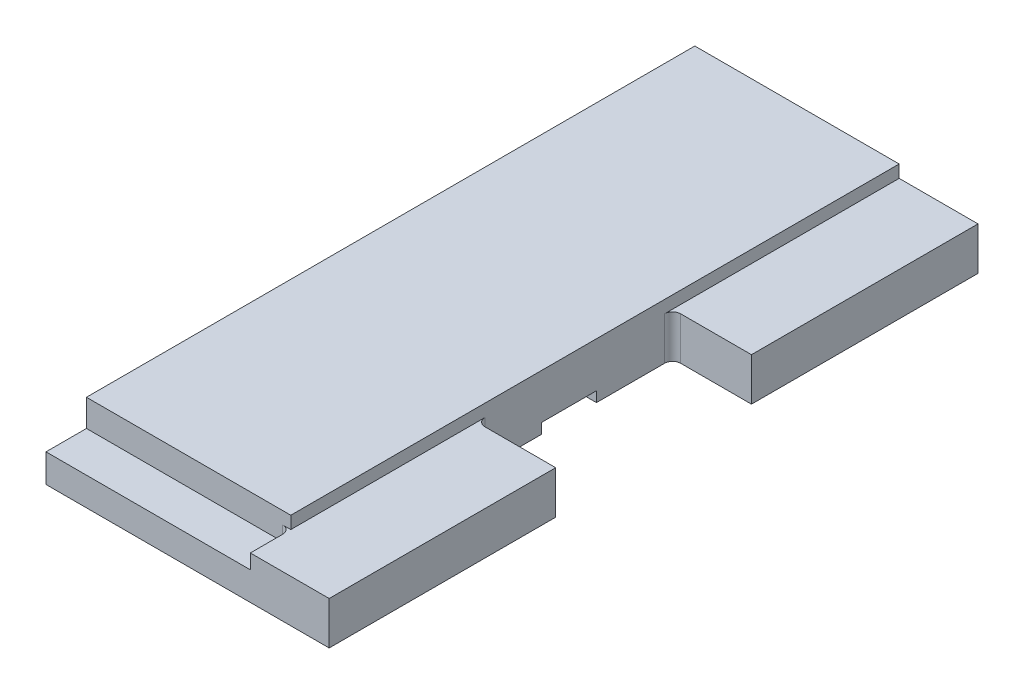
ISO-10303-21;
HEADER;
FILE_DESCRIPTION(('STEP AP214'),'2;1');
FILE_NAME('part.step','',(''),(''),'','','');
FILE_SCHEMA(('AUTOMOTIVE_DESIGN { 1 0 10303 214 1 1 1 1 }'));
ENDSEC;
DATA;
#1=APPLICATION_CONTEXT('core data for automotive mechanical design processes');
#2=APPLICATION_PROTOCOL_DEFINITION('international standard','automotive_design',2000,#1);
#3=PRODUCT_CONTEXT('',#1,'mechanical');
#4=PRODUCT('Part','Part','',(#3));
#5=PRODUCT_RELATED_PRODUCT_CATEGORY('part','',(#4));
#6=PRODUCT_DEFINITION_FORMATION('','',#4);
#7=PRODUCT_DEFINITION_CONTEXT('part definition',#1,'design');
#8=PRODUCT_DEFINITION('design','',#6,#7);
#9=PRODUCT_DEFINITION_SHAPE('','',#8);
#10=(LENGTH_UNIT() NAMED_UNIT(*) SI_UNIT(.MILLI.,.METRE.));
#11=(NAMED_UNIT(*) PLANE_ANGLE_UNIT() SI_UNIT($,.RADIAN.));
#12=(NAMED_UNIT(*) SI_UNIT($,.STERADIAN.) SOLID_ANGLE_UNIT());
#13=UNCERTAINTY_MEASURE_WITH_UNIT(LENGTH_MEASURE(1.E-05),#10,'distance_accuracy_value','');
#14=(GEOMETRIC_REPRESENTATION_CONTEXT(3) GLOBAL_UNCERTAINTY_ASSIGNED_CONTEXT((#13)) GLOBAL_UNIT_ASSIGNED_CONTEXT((#10,
#11,#12)) REPRESENTATION_CONTEXT('',''));
#15=CARTESIAN_POINT('',(0.,0.,0.));
#16=DIRECTION('',(0.,0.,1.));
#17=DIRECTION('',(1.,0.,0.));
#18=AXIS2_PLACEMENT_3D('',#15,#16,#17);
#19=CARTESIAN_POINT('',(13.1275,7.878312,-14.5));
#20=DIRECTION('',(0.,-1.,0.));
#21=DIRECTION('',(0.,0.,1.));
#22=AXIS2_PLACEMENT_3D('',#19,#20,#21);
#23=CYLINDRICAL_SURFACE('',#22,0.5);
#24=CARTESIAN_POINT('',(13.1275,0.,-14.5));
#25=DIRECTION('',(0.,1.,0.));
#26=DIRECTION('',(-1.,0.,0.));
#27=AXIS2_PLACEMENT_3D('',#24,#25,#26);
#28=CIRCLE('',#27,0.5);
#29=CARTESIAN_POINT('',(12.6275,0.,-14.5));
#30=VERTEX_POINT('',#29);
#31=CARTESIAN_POINT('',(13.1275,0.,-14.));
#32=VERTEX_POINT('',#31);
#33=EDGE_CURVE('E476',#30,#32,#28,.T.);
#34=ORIENTED_EDGE('',*,*,#33,.F.);
#35=DIRECTION('',(0.,-1.,0.));
#36=VECTOR('',#35,1.);
#37=CARTESIAN_POINT('',(12.6275,2.649996,-14.5));
#38=LINE('',#37,#36);
#39=CARTESIAN_POINT('',(12.6275,2.649996,-14.5));
#40=VERTEX_POINT('',#39);
#41=EDGE_CURVE('E408',#40,#30,#38,.T.);
#42=ORIENTED_EDGE('',*,*,#41,.F.);
#43=CARTESIAN_POINT('',(13.1275,2.649996,-14.5));
#44=DIRECTION('',(0.,-1.,0.));
#45=DIRECTION('',(0.,0.,1.));
#46=AXIS2_PLACEMENT_3D('',#43,#44,#45);
#47=CIRCLE('',#46,0.5);
#48=CARTESIAN_POINT('',(13.1275,2.649996,-14.));
#49=VERTEX_POINT('',#48);
#50=EDGE_CURVE('E381',#49,#40,#47,.T.);
#51=ORIENTED_EDGE('',*,*,#50,.F.);
#52=DIRECTION('',(0.,-1.,0.));
#53=VECTOR('',#52,1.);
#54=CARTESIAN_POINT('',(13.1275,2.649996,-14.));
#55=LINE('',#54,#53);
#56=EDGE_CURVE('E11',#49,#32,#55,.T.);
#57=ORIENTED_EDGE('',*,*,#56,.T.);
#58=EDGE_LOOP('',(#34,#42,#51,#57));
#59=FACE_BOUND('',#58,.T.);
#60=ADVANCED_FACE('F17',(#59),#23,.F.);
#61=CARTESIAN_POINT('',(12.6275,2.649996,-14.));
#62=DIRECTION('',(0.,0.,1.));
#63=DIRECTION('',(1.,0.,0.));
#64=AXIS2_PLACEMENT_3D('',#61,#62,#63);
#65=PLANE('',#64);
#66=DIRECTION('',(1.,0.,0.));
#67=VECTOR('',#66,1.);
#68=CARTESIAN_POINT('',(13.1275,2.649996,-14.));
#69=LINE('',#68,#67);
#70=CARTESIAN_POINT('',(17.5,2.649996,-14.));
#71=VERTEX_POINT('',#70);
#72=EDGE_CURVE('E605',#49,#71,#69,.T.);
#73=ORIENTED_EDGE('',*,*,#72,.T.);
#74=DIRECTION('',(0.,1.,0.));
#75=VECTOR('',#74,1.);
#76=CARTESIAN_POINT('',(17.5,0.,-14.));
#77=LINE('',#76,#75);
#78=CARTESIAN_POINT('',(17.5,0.,-14.));
#79=VERTEX_POINT('',#78);
#80=EDGE_CURVE('E309',#79,#71,#77,.T.);
#81=ORIENTED_EDGE('',*,*,#80,.F.);
#82=DIRECTION('',(-1.,0.,0.));
#83=VECTOR('',#82,1.);
#84=CARTESIAN_POINT('',(17.5,0.,-14.));
#85=LINE('',#84,#83);
#86=EDGE_CURVE('E486',#79,#32,#85,.T.);
#87=ORIENTED_EDGE('',*,*,#86,.T.);
#88=ORIENTED_EDGE('',*,*,#56,.F.);
#89=EDGE_LOOP('',(#73,#81,#87,#88));
#90=FACE_BOUND('',#89,.T.);
#91=ADVANCED_FACE('F19',(#90),#65,.F.);
#92=CARTESIAN_POINT('',(12.95,0.,-36.41599999935));
#93=DIRECTION('',(1.,0.,0.));
#94=DIRECTION('',(0.,1.,0.));
#95=AXIS2_PLACEMENT_3D('',#92,#93,#94);
#96=PLANE('',#95);
#97=DIRECTION('',(0.,0.,1.));
#98=VECTOR('',#97,1.);
#99=CARTESIAN_POINT('',(12.95,0.,-35.91599999935));
#100=LINE('',#99,#98);
#101=CARTESIAN_POINT('',(12.95,0.,-35.91599999935));
#102=VERTEX_POINT('',#101);
#103=CARTESIAN_POINT('',(12.95,0.,-33.51599999935));
#104=VERTEX_POINT('',#103);
#105=EDGE_CURVE('E391',#102,#104,#100,.T.);
#106=ORIENTED_EDGE('',*,*,#105,.T.);
#107=DIRECTION('',(0.,1.,0.));
#108=VECTOR('',#107,1.);
#109=CARTESIAN_POINT('',(12.95,0.,-33.51599999935));
#110=LINE('',#109,#108);
#111=CARTESIAN_POINT('',(12.95,0.6362,-33.51599999935));
#112=VERTEX_POINT('',#111);
#113=EDGE_CURVE('E27',#104,#112,#110,.T.);
#114=ORIENTED_EDGE('',*,*,#113,.T.);
#115=DIRECTION('',(0.,0.,1.));
#116=VECTOR('',#115,1.);
#117=CARTESIAN_POINT('',(12.95,0.6362,-35.91599999935));
#118=LINE('',#117,#116);
#119=CARTESIAN_POINT('',(12.95,0.6362,-35.91599999935));
#120=VERTEX_POINT('',#119);
#121=EDGE_CURVE('E530',#120,#112,#118,.T.);
#122=ORIENTED_EDGE('',*,*,#121,.F.);
#123=DIRECTION('',(0.,1.,0.));
#124=VECTOR('',#123,1.);
#125=CARTESIAN_POINT('',(12.95,0.,-35.91599999935));
#126=LINE('',#125,#124);
#127=EDGE_CURVE('E347',#102,#120,#126,.T.);
#128=ORIENTED_EDGE('',*,*,#127,.F.);
#129=EDGE_LOOP('',(#106,#114,#122,#128));
#130=FACE_BOUND('',#129,.T.);
#131=ADVANCED_FACE('F669',(#130),#96,.F.);
#132=CARTESIAN_POINT('',(12.45,-4.458312,-33.51599999935));
#133=DIRECTION('',(0.,1.,0.));
#134=DIRECTION('',(0.,0.,1.));
#135=AXIS2_PLACEMENT_3D('',#132,#133,#134);
#136=CYLINDRICAL_SURFACE('',#135,0.5);
#137=ORIENTED_EDGE('',*,*,#113,.F.);
#138=CARTESIAN_POINT('',(12.45,0.,-33.51599999935));
#139=DIRECTION('',(0.,1.,0.));
#140=DIRECTION('',(0.,0.,1.));
#141=AXIS2_PLACEMENT_3D('',#138,#139,#140);
#142=CIRCLE('',#141,0.5);
#143=CARTESIAN_POINT('',(12.45,0.,-33.01599999935));
#144=VERTEX_POINT('',#143);
#145=EDGE_CURVE('E377',#144,#104,#142,.T.);
#146=ORIENTED_EDGE('',*,*,#145,.F.);
#147=DIRECTION('',(0.,1.,0.));
#148=VECTOR('',#147,1.);
#149=CARTESIAN_POINT('',(12.45,0.,-33.01599999935));
#150=LINE('',#149,#148);
#151=CARTESIAN_POINT('',(12.45,0.6362,-33.01599999935));
#152=VERTEX_POINT('',#151);
#153=EDGE_CURVE('E21',#144,#152,#150,.T.);
#154=ORIENTED_EDGE('',*,*,#153,.T.);
#155=CARTESIAN_POINT('',(12.45,0.6362,-33.51599999935));
#156=DIRECTION('',(0.,-1.,0.));
#157=DIRECTION('',(1.,0.,0.));
#158=AXIS2_PLACEMENT_3D('',#155,#156,#157);
#159=CIRCLE('',#158,0.5);
#160=EDGE_CURVE('E482',#112,#152,#159,.T.);
#161=ORIENTED_EDGE('',*,*,#160,.F.);
#162=EDGE_LOOP('',(#137,#146,#154,#161));
#163=FACE_BOUND('',#162,.T.);
#164=ADVANCED_FACE('F661',(#163),#136,.F.);
#165=CARTESIAN_POINT('',(12.95,0.,-33.01599999935));
#166=DIRECTION('',(0.,0.,1.));
#167=DIRECTION('',(1.,0.,0.));
#168=AXIS2_PLACEMENT_3D('',#165,#166,#167);
#169=PLANE('',#168);
#170=DIRECTION('',(-1.,0.,0.));
#171=VECTOR('',#170,1.);
#172=CARTESIAN_POINT('',(12.45,0.,-33.01599999935));
#173=LINE('',#172,#171);
#174=CARTESIAN_POINT('',(0.,0.,-33.01599999935));
#175=VERTEX_POINT('',#174);
#176=EDGE_CURVE('E367',#144,#175,#173,.T.);
#177=ORIENTED_EDGE('',*,*,#176,.T.);
#178=DIRECTION('',(0.,1.,0.));
#179=VECTOR('',#178,1.);
#180=CARTESIAN_POINT('',(0.,0.,-33.01599999935));
#181=LINE('',#180,#179);
#182=CARTESIAN_POINT('',(0.,0.6362,-33.01599999935));
#183=VERTEX_POINT('',#182);
#184=EDGE_CURVE('E436',#175,#183,#181,.T.);
#185=ORIENTED_EDGE('',*,*,#184,.T.);
#186=DIRECTION('',(-1.,0.,0.));
#187=VECTOR('',#186,1.);
#188=CARTESIAN_POINT('',(12.45,0.6362,-33.01599999935));
#189=LINE('',#188,#187);
#190=EDGE_CURVE('E477',#152,#183,#189,.T.);
#191=ORIENTED_EDGE('',*,*,#190,.F.);
#192=ORIENTED_EDGE('',*,*,#153,.F.);
#193=EDGE_LOOP('',(#177,#185,#191,#192));
#194=FACE_BOUND('',#193,.T.);
#195=ADVANCED_FACE('F664',(#194),#169,.F.);
#196=CARTESIAN_POINT('',(0.,0.,-21.39099999935));
#197=DIRECTION('',(0.,0.,-1.));
#198=DIRECTION('',(0.,-1.,0.));
#199=AXIS2_PLACEMENT_3D('',#196,#197,#198);
#200=PLANE('',#199);
#201=DIRECTION('',(0.,1.,0.));
#202=VECTOR('',#201,1.);
#203=CARTESIAN_POINT('',(12.6275,0.,-21.39099999935));
#204=LINE('',#203,#202);
#205=CARTESIAN_POINT('',(12.6275,0.,-21.39099999935));
#206=VERTEX_POINT('',#205);
#207=CARTESIAN_POINT('',(12.6275,0.6362,-21.39099999935));
#208=VERTEX_POINT('',#207);
#209=EDGE_CURVE('E407',#206,#208,#204,.T.);
#210=ORIENTED_EDGE('',*,*,#209,.T.);
#211=DIRECTION('',(1.,0.,0.));
#212=VECTOR('',#211,1.);
#213=CARTESIAN_POINT('',(0.,0.6362,-21.39099999935));
#214=LINE('',#213,#212);
#215=CARTESIAN_POINT('',(0.,0.6362,-21.39099999935));
#216=VERTEX_POINT('',#215);
#217=EDGE_CURVE('E424',#216,#208,#214,.T.);
#218=ORIENTED_EDGE('',*,*,#217,.F.);
#219=DIRECTION('',(0.,1.,0.));
#220=VECTOR('',#219,1.);
#221=CARTESIAN_POINT('',(0.,0.,-21.39099999935));
#222=LINE('',#221,#220);
#223=CARTESIAN_POINT('',(0.,0.,-21.39099999935));
#224=VERTEX_POINT('',#223);
#225=EDGE_CURVE('E439',#224,#216,#222,.T.);
#226=ORIENTED_EDGE('',*,*,#225,.F.);
#227=DIRECTION('',(1.,0.,0.));
#228=VECTOR('',#227,1.);
#229=CARTESIAN_POINT('',(0.,0.,-21.39099999935));
#230=LINE('',#229,#228);
#231=EDGE_CURVE('E359',#224,#206,#230,.T.);
#232=ORIENTED_EDGE('',*,*,#231,.T.);
#233=EDGE_LOOP('',(#210,#218,#226,#232));
#234=FACE_BOUND('',#233,.T.);
#235=ADVANCED_FACE('F777',(#234),#200,.F.);
#236=CARTESIAN_POINT('',(12.6275,0.,-17.99099999935));
#237=DIRECTION('',(0.,0.,1.));
#238=DIRECTION('',(1.,0.,0.));
#239=AXIS2_PLACEMENT_3D('',#236,#237,#238);
#240=PLANE('',#239);
#241=DIRECTION('',(0.,1.,0.));
#242=VECTOR('',#241,1.);
#243=CARTESIAN_POINT('',(0.,0.,-17.99099999935));
#244=LINE('',#243,#242);
#245=CARTESIAN_POINT('',(0.,0.,-17.99099999935));
#246=VERTEX_POINT('',#245);
#247=CARTESIAN_POINT('',(0.,0.6362,-17.99099999935));
#248=VERTEX_POINT('',#247);
#249=EDGE_CURVE('E449',#246,#248,#244,.T.);
#250=ORIENTED_EDGE('',*,*,#249,.T.);
#251=DIRECTION('',(-1.,0.,0.));
#252=VECTOR('',#251,1.);
#253=CARTESIAN_POINT('',(12.6275,0.6362,-17.99099999935));
#254=LINE('',#253,#252);
#255=CARTESIAN_POINT('',(12.6275,0.6362,-17.99099999935));
#256=VERTEX_POINT('',#255);
#257=EDGE_CURVE('E346',#256,#248,#254,.T.);
#258=ORIENTED_EDGE('',*,*,#257,.F.);
#259=DIRECTION('',(0.,1.,0.));
#260=VECTOR('',#259,1.);
#261=CARTESIAN_POINT('',(12.6275,0.,-17.99099999935));
#262=LINE('',#261,#260);
#263=CARTESIAN_POINT('',(12.6275,0.,-17.99099999935));
#264=VERTEX_POINT('',#263);
#265=EDGE_CURVE('E404',#264,#256,#262,.T.);
#266=ORIENTED_EDGE('',*,*,#265,.F.);
#267=DIRECTION('',(-1.,0.,0.));
#268=VECTOR('',#267,1.);
#269=CARTESIAN_POINT('',(12.6275,0.,-17.99099999935));
#270=LINE('',#269,#268);
#271=EDGE_CURVE('E466',#264,#246,#270,.T.);
#272=ORIENTED_EDGE('',*,*,#271,.T.);
#273=EDGE_LOOP('',(#250,#258,#266,#272));
#274=FACE_BOUND('',#273,.T.);
#275=ADVANCED_FACE('F773',(#274),#240,.F.);
#276=CARTESIAN_POINT('',(12.95,0.,-3.790999999351));
#277=DIRECTION('',(0.,0.,1.));
#278=DIRECTION('',(1.,0.,0.));
#279=AXIS2_PLACEMENT_3D('',#276,#277,#278);
#280=PLANE('',#279);
#281=DIRECTION('',(-1.,0.,0.));
#282=VECTOR('',#281,1.);
#283=CARTESIAN_POINT('',(12.45,0.,-3.790999999351));
#284=LINE('',#283,#282);
#285=CARTESIAN_POINT('',(12.45,0.,-3.790999999351));
#286=VERTEX_POINT('',#285);
#287=CARTESIAN_POINT('',(0.,0.,-3.790999999351));
#288=VERTEX_POINT('',#287);
#289=EDGE_CURVE('E423',#286,#288,#284,.T.);
#290=ORIENTED_EDGE('',*,*,#289,.T.);
#291=DIRECTION('',(0.,1.,0.));
#292=VECTOR('',#291,1.);
#293=CARTESIAN_POINT('',(0.,0.,-3.790999999351));
#294=LINE('',#293,#292);
#295=CARTESIAN_POINT('',(0.,0.6362,-3.790999999351));
#296=VERTEX_POINT('',#295);
#297=EDGE_CURVE('E440',#288,#296,#294,.T.);
#298=ORIENTED_EDGE('',*,*,#297,.T.);
#299=DIRECTION('',(-1.,0.,0.));
#300=VECTOR('',#299,1.);
#301=CARTESIAN_POINT('',(12.45,0.6362,-3.790999999351));
#302=LINE('',#301,#300);
#303=CARTESIAN_POINT('',(12.45,0.6362,-3.790999999351));
#304=VERTEX_POINT('',#303);
#305=EDGE_CURVE('E550',#304,#296,#302,.T.);
#306=ORIENTED_EDGE('',*,*,#305,.F.);
#307=DIRECTION('',(0.,1.,0.));
#308=VECTOR('',#307,1.);
#309=CARTESIAN_POINT('',(12.45,0.,-3.790999999351));
#310=LINE('',#309,#308);
#311=EDGE_CURVE('E642',#286,#304,#310,.T.);
#312=ORIENTED_EDGE('',*,*,#311,.F.);
#313=EDGE_LOOP('',(#290,#298,#306,#312));
#314=FACE_BOUND('',#313,.T.);
#315=ADVANCED_FACE('F770',(#314),#280,.F.);
#316=CARTESIAN_POINT('',(12.45,-4.458312,-4.290999999351));
#317=DIRECTION('',(0.,1.,0.));
#318=DIRECTION('',(0.,0.,1.));
#319=AXIS2_PLACEMENT_3D('',#316,#317,#318);
#320=CYLINDRICAL_SURFACE('',#319,0.5);
#321=DIRECTION('',(0.,1.,0.));
#322=VECTOR('',#321,1.);
#323=CARTESIAN_POINT('',(12.95,0.,-4.290999999351));
#324=LINE('',#323,#322);
#325=CARTESIAN_POINT('',(12.95,0.,-4.290999999351));
#326=VERTEX_POINT('',#325);
#327=CARTESIAN_POINT('',(12.95,0.6362,-4.290999999351));
#328=VERTEX_POINT('',#327);
#329=EDGE_CURVE('E639',#326,#328,#324,.T.);
#330=ORIENTED_EDGE('',*,*,#329,.F.);
#331=CARTESIAN_POINT('',(12.45,0.,-4.290999999351));
#332=DIRECTION('',(0.,1.,0.));
#333=DIRECTION('',(0.,0.,1.));
#334=AXIS2_PLACEMENT_3D('',#331,#332,#333);
#335=CIRCLE('',#334,0.5);
#336=EDGE_CURVE('E387',#286,#326,#335,.T.);
#337=ORIENTED_EDGE('',*,*,#336,.F.);
#338=ORIENTED_EDGE('',*,*,#311,.T.);
#339=CARTESIAN_POINT('',(12.45,0.6362,-4.290999999351));
#340=DIRECTION('',(0.,-1.,0.));
#341=DIRECTION('',(1.,0.,0.));
#342=AXIS2_PLACEMENT_3D('',#339,#340,#341);
#343=CIRCLE('',#342,0.5);
#344=EDGE_CURVE('E415',#328,#304,#343,.T.);
#345=ORIENTED_EDGE('',*,*,#344,.F.);
#346=EDGE_LOOP('',(#330,#337,#338,#345));
#347=FACE_BOUND('',#346,.T.);
#348=ADVANCED_FACE('F750',(#347),#320,.F.);
#349=CARTESIAN_POINT('',(12.95,0.,-7.190999999351));
#350=DIRECTION('',(1.,0.,0.));
#351=DIRECTION('',(0.,1.,0.));
#352=AXIS2_PLACEMENT_3D('',#349,#350,#351);
#353=PLANE('',#352);
#354=DIRECTION('',(0.,0.,1.));
#355=VECTOR('',#354,1.);
#356=CARTESIAN_POINT('',(12.95,0.6362,-6.690999999351));
#357=LINE('',#356,#355);
#358=CARTESIAN_POINT('',(12.95,0.6362,-6.690999999351));
#359=VERTEX_POINT('',#358);
#360=EDGE_CURVE('E420',#359,#328,#357,.T.);
#361=ORIENTED_EDGE('',*,*,#360,.F.);
#362=DIRECTION('',(0.,1.,0.));
#363=VECTOR('',#362,1.);
#364=CARTESIAN_POINT('',(12.95,0.,-6.690999999351));
#365=LINE('',#364,#363);
#366=CARTESIAN_POINT('',(12.95,0.,-6.690999999351));
#367=VERTEX_POINT('',#366);
#368=EDGE_CURVE('E570',#367,#359,#365,.T.);
#369=ORIENTED_EDGE('',*,*,#368,.F.);
#370=DIRECTION('',(0.,0.,1.));
#371=VECTOR('',#370,1.);
#372=CARTESIAN_POINT('',(12.95,0.,-6.690999999351));
#373=LINE('',#372,#371);
#374=EDGE_CURVE('E382',#367,#326,#373,.T.);
#375=ORIENTED_EDGE('',*,*,#374,.T.);
#376=ORIENTED_EDGE('',*,*,#329,.T.);
#377=EDGE_LOOP('',(#361,#369,#375,#376));
#378=FACE_BOUND('',#377,.T.);
#379=ADVANCED_FACE('F746',(#378),#353,.F.);
#380=CARTESIAN_POINT('',(12.45,-4.458312,-6.690999999351));
#381=DIRECTION('',(0.,1.,0.));
#382=DIRECTION('',(1.,0.,0.));
#383=AXIS2_PLACEMENT_3D('',#380,#381,#382);
#384=CYLINDRICAL_SURFACE('',#383,0.5);
#385=DIRECTION('',(0.,1.,0.));
#386=VECTOR('',#385,1.);
#387=CARTESIAN_POINT('',(12.45,0.,-7.190999999351));
#388=LINE('',#387,#386);
#389=CARTESIAN_POINT('',(12.45,0.,-7.190999999351));
#390=VERTEX_POINT('',#389);
#391=CARTESIAN_POINT('',(12.45,0.6362,-7.190999999351));
#392=VERTEX_POINT('',#391);
#393=EDGE_CURVE('E448',#390,#392,#388,.T.);
#394=ORIENTED_EDGE('',*,*,#393,.F.);
#395=CARTESIAN_POINT('',(12.45,0.,-6.690999999351));
#396=DIRECTION('',(0.,1.,0.));
#397=DIRECTION('',(1.,0.,0.));
#398=AXIS2_PLACEMENT_3D('',#395,#396,#397);
#399=CIRCLE('',#398,0.5);
#400=EDGE_CURVE('E386',#367,#390,#399,.T.);
#401=ORIENTED_EDGE('',*,*,#400,.F.);
#402=ORIENTED_EDGE('',*,*,#368,.T.);
#403=CARTESIAN_POINT('',(12.45,0.6362,-6.690999999351));
#404=DIRECTION('',(0.,-1.,0.));
#405=DIRECTION('',(0.,0.,-1.));
#406=AXIS2_PLACEMENT_3D('',#403,#404,#405);
#407=CIRCLE('',#406,0.5);
#408=EDGE_CURVE('E490',#392,#359,#407,.T.);
#409=ORIENTED_EDGE('',*,*,#408,.F.);
#410=EDGE_LOOP('',(#394,#401,#402,#409));
#411=FACE_BOUND('',#410,.T.);
#412=ADVANCED_FACE('F749',(#411),#384,.F.);
#413=CARTESIAN_POINT('',(0.,0.,-7.190999999351));
#414=DIRECTION('',(0.,0.,-1.));
#415=DIRECTION('',(0.,-1.,0.));
#416=AXIS2_PLACEMENT_3D('',#413,#414,#415);
#417=PLANE('',#416);
#418=DIRECTION('',(1.,0.,0.));
#419=VECTOR('',#418,1.);
#420=CARTESIAN_POINT('',(0.,0.6362,-7.190999999351));
#421=LINE('',#420,#419);
#422=CARTESIAN_POINT('',(0.,0.6362,-7.190999999351));
#423=VERTEX_POINT('',#422);
#424=EDGE_CURVE('E494',#423,#392,#421,.T.);
#425=ORIENTED_EDGE('',*,*,#424,.F.);
#426=DIRECTION('',(0.,1.,0.));
#427=VECTOR('',#426,1.);
#428=CARTESIAN_POINT('',(0.,0.,-7.190999999351));
#429=LINE('',#428,#427);
#430=CARTESIAN_POINT('',(0.,0.,-7.190999999351));
#431=VERTEX_POINT('',#430);
#432=EDGE_CURVE('E445',#431,#423,#429,.T.);
#433=ORIENTED_EDGE('',*,*,#432,.F.);
#434=DIRECTION('',(1.,0.,0.));
#435=VECTOR('',#434,1.);
#436=CARTESIAN_POINT('',(0.,0.,-7.190999999351));
#437=LINE('',#436,#435);
#438=EDGE_CURVE('E444',#431,#390,#437,.T.);
#439=ORIENTED_EDGE('',*,*,#438,.T.);
#440=ORIENTED_EDGE('',*,*,#393,.T.);
#441=EDGE_LOOP('',(#425,#433,#439,#440));
#442=FACE_BOUND('',#441,.T.);
#443=ADVANCED_FACE('F761',(#442),#417,.F.);
#444=CARTESIAN_POINT('',(0.,0.,-40.0977));
#445=DIRECTION('',(-1.,0.,0.));
#446=DIRECTION('',(0.,0.,1.));
#447=AXIS2_PLACEMENT_3D('',#444,#445,#446);
#448=PLANE('',#447);
#449=ORIENTED_EDGE('',*,*,#297,.F.);
#450=DIRECTION('',(0.,0.,1.));
#451=VECTOR('',#450,1.);
#452=CARTESIAN_POINT('',(0.,0.,-3.790999999351));
#453=LINE('',#452,#451);
#454=CARTESIAN_POINT('',(0.,0.,0.));
#455=VERTEX_POINT('',#454);
#456=EDGE_CURVE('E372',#288,#455,#453,.T.);
#457=ORIENTED_EDGE('',*,*,#456,.T.);
#458=DIRECTION('',(0.,1.,0.));
#459=VECTOR('',#458,1.);
#460=CARTESIAN_POINT('',(0.,0.,0.));
#461=LINE('',#460,#459);
#462=CARTESIAN_POINT('',(0.,1.74919,0.));
#463=VERTEX_POINT('',#462);
#464=EDGE_CURVE('E50',#455,#463,#461,.T.);
#465=ORIENTED_EDGE('',*,*,#464,.T.);
#466=DIRECTION('',(0.,0.,-1.));
#467=VECTOR('',#466,1.);
#468=CARTESIAN_POINT('',(0.,1.74919,0.));
#469=LINE('',#468,#467);
#470=CARTESIAN_POINT('',(0.,1.74919,-2.5));
#471=VERTEX_POINT('',#470);
#472=EDGE_CURVE('E631',#463,#471,#469,.T.);
#473=ORIENTED_EDGE('',*,*,#472,.T.);
#474=DIRECTION('',(0.,-1.,0.));
#475=VECTOR('',#474,1.);
#476=CARTESIAN_POINT('',(0.,3.42,-2.5));
#477=LINE('',#476,#475);
#478=CARTESIAN_POINT('',(0.,3.42,-2.5));
#479=VERTEX_POINT('',#478);
#480=EDGE_CURVE('E338',#479,#471,#477,.T.);
#481=ORIENTED_EDGE('',*,*,#480,.F.);
#482=DIRECTION('',(0.,0.,1.));
#483=VECTOR('',#482,1.);
#484=CARTESIAN_POINT('',(0.,3.42,-40.0977));
#485=LINE('',#484,#483);
#486=CARTESIAN_POINT('',(0.,3.42,-40.0977));
#487=VERTEX_POINT('',#486);
#488=EDGE_CURVE('E304',#487,#479,#485,.T.);
#489=ORIENTED_EDGE('',*,*,#488,.F.);
#490=DIRECTION('',(0.,1.,0.));
#491=VECTOR('',#490,1.);
#492=CARTESIAN_POINT('',(0.,0.,-40.0977));
#493=LINE('',#492,#491);
#494=CARTESIAN_POINT('',(0.,0.,-40.0977));
#495=VERTEX_POINT('',#494);
#496=EDGE_CURVE('E297',#495,#487,#493,.T.);
#497=ORIENTED_EDGE('',*,*,#496,.F.);
#498=DIRECTION('',(0.,0.,1.));
#499=VECTOR('',#498,1.);
#500=CARTESIAN_POINT('',(0.,0.,-40.0977));
#501=LINE('',#500,#499);
#502=CARTESIAN_POINT('',(0.,0.,-36.41599999935));
#503=VERTEX_POINT('',#502);
#504=EDGE_CURVE('E302',#495,#503,#501,.T.);
#505=ORIENTED_EDGE('',*,*,#504,.T.);
#506=DIRECTION('',(0.,1.,0.));
#507=VECTOR('',#506,1.);
#508=CARTESIAN_POINT('',(0.,0.,-36.41599999935));
#509=LINE('',#508,#507);
#510=CARTESIAN_POINT('',(0.,0.6362,-36.41599999935));
#511=VERTEX_POINT('',#510);
#512=EDGE_CURVE('E392',#503,#511,#509,.T.);
#513=ORIENTED_EDGE('',*,*,#512,.T.);
#514=DIRECTION('',(0.,0.,-1.));
#515=VECTOR('',#514,1.);
#516=CARTESIAN_POINT('',(0.,0.6362,-33.01599999935));
#517=LINE('',#516,#515);
#518=EDGE_CURVE('E481',#183,#511,#517,.T.);
#519=ORIENTED_EDGE('',*,*,#518,.F.);
#520=ORIENTED_EDGE('',*,*,#184,.F.);
#521=DIRECTION('',(0.,0.,1.));
#522=VECTOR('',#521,1.);
#523=CARTESIAN_POINT('',(0.,0.,-33.01599999935));
#524=LINE('',#523,#522);
#525=EDGE_CURVE('E363',#175,#224,#524,.T.);
#526=ORIENTED_EDGE('',*,*,#525,.T.);
#527=ORIENTED_EDGE('',*,*,#225,.T.);
#528=DIRECTION('',(0.,0.,-1.));
#529=VECTOR('',#528,1.);
#530=CARTESIAN_POINT('',(0.,0.6362,-17.99099999935));
#531=LINE('',#530,#529);
#532=EDGE_CURVE('E429',#248,#216,#531,.T.);
#533=ORIENTED_EDGE('',*,*,#532,.F.);
#534=ORIENTED_EDGE('',*,*,#249,.F.);
#535=DIRECTION('',(0.,0.,1.));
#536=VECTOR('',#535,1.);
#537=CARTESIAN_POINT('',(0.,0.,-17.99099999935));
#538=LINE('',#537,#536);
#539=EDGE_CURVE('E459',#246,#431,#538,.T.);
#540=ORIENTED_EDGE('',*,*,#539,.T.);
#541=ORIENTED_EDGE('',*,*,#432,.T.);
#542=DIRECTION('',(0.,0.,-1.));
#543=VECTOR('',#542,1.);
#544=CARTESIAN_POINT('',(0.,0.6362,-3.790999999351));
#545=LINE('',#544,#543);
#546=EDGE_CURVE('E554',#296,#423,#545,.T.);
#547=ORIENTED_EDGE('',*,*,#546,.F.);
#548=EDGE_LOOP('',(#449,#457,#465,#473,#481,#489,#497,#505,#513,#519,#520,#526,#527,#533,#534,
#540,#541,#547));
#549=FACE_BOUND('',#548,.T.);
#550=ADVANCED_FACE('F299',(#549),#448,.T.);
#551=CARTESIAN_POINT('',(0.,0.,0.));
#552=DIRECTION('',(0.,0.,1.));
#553=DIRECTION('',(1.,0.,0.));
#554=AXIS2_PLACEMENT_3D('',#551,#552,#553);
#555=PLANE('',#554);
#556=ORIENTED_EDGE('',*,*,#464,.F.);
#557=DIRECTION('',(1.,0.,0.));
#558=VECTOR('',#557,1.);
#559=CARTESIAN_POINT('',(0.,0.,0.));
#560=LINE('',#559,#558);
#561=CARTESIAN_POINT('',(17.5,0.,0.));
#562=VERTEX_POINT('',#561);
#563=EDGE_CURVE('E368',#455,#562,#560,.T.);
#564=ORIENTED_EDGE('',*,*,#563,.T.);
#565=DIRECTION('',(0.,1.,0.));
#566=VECTOR('',#565,1.);
#567=CARTESIAN_POINT('',(17.5,0.,0.));
#568=LINE('',#567,#566);
#569=CARTESIAN_POINT('',(17.5,2.649996,0.));
#570=VERTEX_POINT('',#569);
#571=EDGE_CURVE('E609',#562,#570,#568,.T.);
#572=ORIENTED_EDGE('',*,*,#571,.T.);
#573=DIRECTION('',(-1.,0.,0.));
#574=VECTOR('',#573,1.);
#575=CARTESIAN_POINT('',(17.5,2.649996,0.));
#576=LINE('',#575,#574);
#577=CARTESIAN_POINT('',(12.6275,2.649996,0.));
#578=VERTEX_POINT('',#577);
#579=EDGE_CURVE('E543',#570,#578,#576,.T.);
#580=ORIENTED_EDGE('',*,*,#579,.T.);
#581=DIRECTION('',(0.,-1.,0.));
#582=VECTOR('',#581,1.);
#583=CARTESIAN_POINT('',(12.6275,2.649996,0.));
#584=LINE('',#583,#582);
#585=CARTESIAN_POINT('',(12.6275,1.74919,0.));
#586=VERTEX_POINT('',#585);
#587=EDGE_CURVE('E40',#578,#586,#584,.T.);
#588=ORIENTED_EDGE('',*,*,#587,.T.);
#589=DIRECTION('',(1.,0.,0.));
#590=VECTOR('',#589,1.);
#591=CARTESIAN_POINT('',(0.,1.74919,0.));
#592=LINE('',#591,#590);
#593=EDGE_CURVE('E635',#463,#586,#592,.T.);
#594=ORIENTED_EDGE('',*,*,#593,.F.);
#595=EDGE_LOOP('',(#556,#564,#572,#580,#588,#594));
#596=FACE_BOUND('',#595,.T.);
#597=ADVANCED_FACE('F756',(#596),#555,.T.);
#598=CARTESIAN_POINT('',(12.6275,3.42,0.));
#599=DIRECTION('',(1.,0.,0.));
#600=DIRECTION('',(0.,1.,0.));
#601=AXIS2_PLACEMENT_3D('',#598,#599,#600);
#602=PLANE('',#601);
#603=DIRECTION('',(0.,0.,-1.));
#604=VECTOR('',#603,1.);
#605=CARTESIAN_POINT('',(12.6275,1.74919,0.));
#606=LINE('',#605,#604);
#607=CARTESIAN_POINT('',(12.6275,1.74919,-2.));
#608=VERTEX_POINT('',#607);
#609=EDGE_CURVE('E618',#586,#608,#606,.T.);
#610=ORIENTED_EDGE('',*,*,#609,.F.);
#611=ORIENTED_EDGE('',*,*,#587,.F.);
#612=DIRECTION('',(0.,0.,-1.));
#613=VECTOR('',#612,1.);
#614=CARTESIAN_POINT('',(12.6275,2.649996,0.));
#615=LINE('',#614,#613);
#616=CARTESIAN_POINT('',(12.6275,2.649996,-2.));
#617=VERTEX_POINT('',#616);
#618=EDGE_CURVE('E547',#578,#617,#615,.T.);
#619=ORIENTED_EDGE('',*,*,#618,.T.);
#620=DIRECTION('',(0.,-1.,0.));
#621=VECTOR('',#620,1.);
#622=CARTESIAN_POINT('',(12.6275,2.649996,-2.));
#623=LINE('',#622,#621);
#624=EDGE_CURVE('E454',#617,#608,#623,.T.);
#625=ORIENTED_EDGE('',*,*,#624,.T.);
#626=EDGE_LOOP('',(#610,#611,#619,#625));
#627=FACE_BOUND('',#626,.T.);
#628=ADVANCED_FACE('F754',(#627),#602,.F.);
#629=CARTESIAN_POINT('',(0.,1.74919,0.));
#630=DIRECTION('',(0.,1.,0.));
#631=DIRECTION('',(1.,0.,0.));
#632=AXIS2_PLACEMENT_3D('',#629,#630,#631);
#633=PLANE('',#632);
#634=DIRECTION('',(-1.,0.,0.));
#635=VECTOR('',#634,1.);
#636=CARTESIAN_POINT('',(12.1275,1.74919,-2.5));
#637=LINE('',#636,#635);
#638=CARTESIAN_POINT('',(12.1275,1.74919,-2.5));
#639=VERTEX_POINT('',#638);
#640=EDGE_CURVE('E455',#639,#471,#637,.T.);
#641=ORIENTED_EDGE('',*,*,#640,.T.);
#642=ORIENTED_EDGE('',*,*,#472,.F.);
#643=ORIENTED_EDGE('',*,*,#593,.T.);
#644=ORIENTED_EDGE('',*,*,#609,.T.);
#645=CARTESIAN_POINT('',(12.1275,1.74919,-2.));
#646=DIRECTION('',(0.,1.,0.));
#647=DIRECTION('',(1.,0.,0.));
#648=AXIS2_PLACEMENT_3D('',#645,#646,#647);
#649=CIRCLE('',#648,0.5);
#650=EDGE_CURVE('E626',#608,#639,#649,.T.);
#651=ORIENTED_EDGE('',*,*,#650,.T.);
#652=EDGE_LOOP('',(#641,#642,#643,#644,#651));
#653=FACE_BOUND('',#652,.T.);
#654=ADVANCED_FACE('F744',(#653),#633,.T.);
#655=CARTESIAN_POINT('',(12.1275,7.878312,-2.));
#656=DIRECTION('',(0.,-1.,0.));
#657=DIRECTION('',(0.,0.,-1.));
#658=AXIS2_PLACEMENT_3D('',#655,#656,#657);
#659=CYLINDRICAL_SURFACE('',#658,0.5);
#660=ORIENTED_EDGE('',*,*,#624,.F.);
#661=CARTESIAN_POINT('',(12.1275,2.649996,-2.));
#662=DIRECTION('',(0.,-1.,0.));
#663=DIRECTION('',(0.,0.,-1.));
#664=AXIS2_PLACEMENT_3D('',#661,#662,#663);
#665=CIRCLE('',#664,0.5);
#666=CARTESIAN_POINT('',(12.1275,2.649996,-2.5));
#667=VERTEX_POINT('',#666);
#668=EDGE_CURVE('E595',#667,#617,#665,.T.);
#669=ORIENTED_EDGE('',*,*,#668,.F.);
#670=DIRECTION('',(0.,-1.,0.));
#671=VECTOR('',#670,1.);
#672=CARTESIAN_POINT('',(12.1275,2.649996,-2.5));
#673=LINE('',#672,#671);
#674=EDGE_CURVE('E450',#667,#639,#673,.T.);
#675=ORIENTED_EDGE('',*,*,#674,.T.);
#676=ORIENTED_EDGE('',*,*,#650,.F.);
#677=EDGE_LOOP('',(#660,#669,#675,#676));
#678=FACE_BOUND('',#677,.T.);
#679=ADVANCED_FACE('F741',(#678),#659,.F.);
#680=CARTESIAN_POINT('',(12.6275,3.42,-2.5));
#681=DIRECTION('',(0.,0.,-1.));
#682=DIRECTION('',(0.,-1.,0.));
#683=AXIS2_PLACEMENT_3D('',#680,#681,#682);
#684=PLANE('',#683);
#685=DIRECTION('',(1.,0.,0.));
#686=VECTOR('',#685,1.);
#687=CARTESIAN_POINT('',(12.1275,2.649996,-2.5));
#688=LINE('',#687,#686);
#689=CARTESIAN_POINT('',(12.6275,2.649996,-2.5));
#690=VERTEX_POINT('',#689);
#691=EDGE_CURVE('E538',#667,#690,#688,.T.);
#692=ORIENTED_EDGE('',*,*,#691,.T.);
#693=DIRECTION('',(0.,1.,0.));
#694=VECTOR('',#693,1.);
#695=CARTESIAN_POINT('',(12.6275,2.649996,-2.5));
#696=LINE('',#695,#694);
#697=CARTESIAN_POINT('',(12.6275,3.42,-2.5));
#698=VERTEX_POINT('',#697);
#699=EDGE_CURVE('E564',#690,#698,#696,.T.);
#700=ORIENTED_EDGE('',*,*,#699,.T.);
#701=DIRECTION('',(1.,0.,0.));
#702=VECTOR('',#701,1.);
#703=CARTESIAN_POINT('',(0.,3.42,-2.5));
#704=LINE('',#703,#702);
#705=EDGE_CURVE('E335',#479,#698,#704,.T.);
#706=ORIENTED_EDGE('',*,*,#705,.F.);
#707=ORIENTED_EDGE('',*,*,#480,.T.);
#708=ORIENTED_EDGE('',*,*,#640,.F.);
#709=ORIENTED_EDGE('',*,*,#674,.F.);
#710=EDGE_LOOP('',(#692,#700,#706,#707,#708,#709));
#711=FACE_BOUND('',#710,.T.);
#712=ADVANCED_FACE('F727',(#711),#684,.F.);
#713=CARTESIAN_POINT('',(0.,3.42,0.));
#714=DIRECTION('',(0.,1.,0.));
#715=DIRECTION('',(1.,0.,0.));
#716=AXIS2_PLACEMENT_3D('',#713,#714,#715);
#717=PLANE('',#716);
#718=DIRECTION('',(0.,0.,-1.));
#719=VECTOR('',#718,1.);
#720=CARTESIAN_POINT('',(12.6275,3.42,-2.5));
#721=LINE('',#720,#719);
#722=CARTESIAN_POINT('',(12.6275,3.42,-40.0977));
#723=VERTEX_POINT('',#722);
#724=EDGE_CURVE('E526',#698,#723,#721,.T.);
#725=ORIENTED_EDGE('',*,*,#724,.T.);
#726=DIRECTION('',(-1.,0.,0.));
#727=VECTOR('',#726,1.);
#728=CARTESIAN_POINT('',(12.6275,3.42,-40.0977));
#729=LINE('',#728,#727);
#730=EDGE_CURVE('E308',#723,#487,#729,.T.);
#731=ORIENTED_EDGE('',*,*,#730,.T.);
#732=ORIENTED_EDGE('',*,*,#488,.T.);
#733=ORIENTED_EDGE('',*,*,#705,.T.);
#734=EDGE_LOOP('',(#725,#731,#732,#733));
#735=FACE_BOUND('',#734,.T.);
#736=ADVANCED_FACE('F724',(#735),#717,.T.);
#737=CARTESIAN_POINT('',(17.5,0.,-40.0977));
#738=DIRECTION('',(0.,0.,-1.));
#739=DIRECTION('',(0.,-1.,0.));
#740=AXIS2_PLACEMENT_3D('',#737,#738,#739);
#741=PLANE('',#740);
#742=DIRECTION('',(0.,1.,0.));
#743=VECTOR('',#742,1.);
#744=CARTESIAN_POINT('',(17.5,0.,-40.0977));
#745=LINE('',#744,#743);
#746=CARTESIAN_POINT('',(17.5,0.,-40.0977));
#747=VERTEX_POINT('',#746);
#748=CARTESIAN_POINT('',(17.5,2.649996,-40.0977));
#749=VERTEX_POINT('',#748);
#750=EDGE_CURVE('E315',#747,#749,#745,.T.);
#751=ORIENTED_EDGE('',*,*,#750,.F.);
#752=DIRECTION('',(-1.,0.,0.));
#753=VECTOR('',#752,1.);
#754=CARTESIAN_POINT('',(17.5,0.,-40.0977));
#755=LINE('',#754,#753);
#756=EDGE_CURVE('E312',#747,#495,#755,.T.);
#757=ORIENTED_EDGE('',*,*,#756,.T.);
#758=ORIENTED_EDGE('',*,*,#496,.T.);
#759=ORIENTED_EDGE('',*,*,#730,.F.);
#760=DIRECTION('',(0.,-1.,0.));
#761=VECTOR('',#760,1.);
#762=CARTESIAN_POINT('',(12.6275,3.42,-40.0977));
#763=LINE('',#762,#761);
#764=CARTESIAN_POINT('',(12.6275,2.649996,-40.0977));
#765=VERTEX_POINT('',#764);
#766=EDGE_CURVE('E522',#723,#765,#763,.T.);
#767=ORIENTED_EDGE('',*,*,#766,.T.);
#768=DIRECTION('',(-1.,0.,0.));
#769=VECTOR('',#768,1.);
#770=CARTESIAN_POINT('',(17.5,2.649996,-40.0977));
#771=LINE('',#770,#769);
#772=EDGE_CURVE('E539',#749,#765,#771,.T.);
#773=ORIENTED_EDGE('',*,*,#772,.F.);
#774=EDGE_LOOP('',(#751,#757,#758,#759,#767,#773));
#775=FACE_BOUND('',#774,.T.);
#776=ADVANCED_FACE('F313',(#775),#741,.T.);
#777=CARTESIAN_POINT('',(17.5,0.,0.));
#778=DIRECTION('',(1.,0.,0.));
#779=DIRECTION('',(0.,1.,0.));
#780=AXIS2_PLACEMENT_3D('',#777,#778,#779);
#781=PLANE('',#780);
#782=DIRECTION('',(0.,0.,-1.));
#783=VECTOR('',#782,1.);
#784=CARTESIAN_POINT('',(17.5,2.649996,0.));
#785=LINE('',#784,#783);
#786=EDGE_CURVE('E546',#570,#71,#785,.T.);
#787=ORIENTED_EDGE('',*,*,#786,.F.);
#788=ORIENTED_EDGE('',*,*,#571,.F.);
#789=DIRECTION('',(0.,0.,-1.));
#790=VECTOR('',#789,1.);
#791=CARTESIAN_POINT('',(17.5,0.,0.));
#792=LINE('',#791,#790);
#793=EDGE_CURVE('E373',#562,#79,#792,.T.);
#794=ORIENTED_EDGE('',*,*,#793,.T.);
#795=ORIENTED_EDGE('',*,*,#80,.T.);
#796=EDGE_LOOP('',(#787,#788,#794,#795));
#797=FACE_BOUND('',#796,.T.);
#798=ADVANCED_FACE('F715',(#797),#781,.T.);
#799=CARTESIAN_POINT('',(17.5,0.,0.));
#800=DIRECTION('',(1.,0.,0.));
#801=DIRECTION('',(0.,1.,0.));
#802=AXIS2_PLACEMENT_3D('',#799,#800,#801);
#803=PLANE('',#802);
#804=DIRECTION('',(0.,0.,-1.));
#805=VECTOR('',#804,1.);
#806=CARTESIAN_POINT('',(17.5,0.,-26.0977));
#807=LINE('',#806,#805);
#808=CARTESIAN_POINT('',(17.5,0.,-26.0977));
#809=VERTEX_POINT('',#808);
#810=EDGE_CURVE('E320',#809,#747,#807,.T.);
#811=ORIENTED_EDGE('',*,*,#810,.T.);
#812=ORIENTED_EDGE('',*,*,#750,.T.);
#813=DIRECTION('',(0.,0.,-1.));
#814=VECTOR('',#813,1.);
#815=CARTESIAN_POINT('',(17.5,2.649996,-26.0977));
#816=LINE('',#815,#814);
#817=CARTESIAN_POINT('',(17.5,2.649996,-26.0977));
#818=VERTEX_POINT('',#817);
#819=EDGE_CURVE('E587',#818,#749,#816,.T.);
#820=ORIENTED_EDGE('',*,*,#819,.F.);
#821=DIRECTION('',(0.,1.,0.));
#822=VECTOR('',#821,1.);
#823=CARTESIAN_POINT('',(17.5,0.,-26.0977));
#824=LINE('',#823,#822);
#825=EDGE_CURVE('E378',#809,#818,#824,.T.);
#826=ORIENTED_EDGE('',*,*,#825,.F.);
#827=EDGE_LOOP('',(#811,#812,#820,#826));
#828=FACE_BOUND('',#827,.T.);
#829=ADVANCED_FACE('F718',(#828),#803,.T.);
#830=CARTESIAN_POINT('',(17.5,2.649996,-26.0977));
#831=DIRECTION('',(0.,0.,-1.));
#832=DIRECTION('',(0.,-1.,0.));
#833=AXIS2_PLACEMENT_3D('',#830,#831,#832);
#834=PLANE('',#833);
#835=DIRECTION('',(-1.,0.,0.));
#836=VECTOR('',#835,1.);
#837=CARTESIAN_POINT('',(17.5,0.,-26.0977));
#838=LINE('',#837,#836);
#839=CARTESIAN_POINT('',(13.1275,0.,-26.0977));
#840=VERTEX_POINT('',#839);
#841=EDGE_CURVE('E341',#809,#840,#838,.T.);
#842=ORIENTED_EDGE('',*,*,#841,.F.);
#843=ORIENTED_EDGE('',*,*,#825,.T.);
#844=DIRECTION('',(1.,0.,0.));
#845=VECTOR('',#844,1.);
#846=CARTESIAN_POINT('',(13.1275,2.649996,-26.0977));
#847=LINE('',#846,#845);
#848=CARTESIAN_POINT('',(13.1275,2.649996,-26.0977));
#849=VERTEX_POINT('',#848);
#850=EDGE_CURVE('E534',#849,#818,#847,.T.);
#851=ORIENTED_EDGE('',*,*,#850,.F.);
#852=DIRECTION('',(0.,-1.,0.));
#853=VECTOR('',#852,1.);
#854=CARTESIAN_POINT('',(13.1275,2.649996,-26.0977));
#855=LINE('',#854,#853);
#856=EDGE_CURVE('E511',#849,#840,#855,.T.);
#857=ORIENTED_EDGE('',*,*,#856,.T.);
#858=EDGE_LOOP('',(#842,#843,#851,#857));
#859=FACE_BOUND('',#858,.T.);
#860=ADVANCED_FACE('F703',(#859),#834,.F.);
#861=CARTESIAN_POINT('',(0.,2.649996,0.));
#862=DIRECTION('',(0.,1.,0.));
#863=DIRECTION('',(1.,0.,0.));
#864=AXIS2_PLACEMENT_3D('',#861,#862,#863);
#865=PLANE('',#864);
#866=ORIENTED_EDGE('',*,*,#691,.F.);
#867=ORIENTED_EDGE('',*,*,#668,.T.);
#868=ORIENTED_EDGE('',*,*,#618,.F.);
#869=ORIENTED_EDGE('',*,*,#579,.F.);
#870=ORIENTED_EDGE('',*,*,#786,.T.);
#871=ORIENTED_EDGE('',*,*,#72,.F.);
#872=ORIENTED_EDGE('',*,*,#50,.T.);
#873=DIRECTION('',(0.,0.,-1.));
#874=VECTOR('',#873,1.);
#875=CARTESIAN_POINT('',(12.6275,2.649996,-2.5));
#876=LINE('',#875,#874);
#877=EDGE_CURVE('E574',#690,#40,#876,.T.);
#878=ORIENTED_EDGE('',*,*,#877,.F.);
#879=EDGE_LOOP('',(#866,#867,#868,#869,#870,#871,#872,#878));
#880=FACE_BOUND('',#879,.T.);
#881=ADVANCED_FACE('F731',(#880),#865,.T.);
#882=CARTESIAN_POINT('',(0.,2.649996,0.));
#883=DIRECTION('',(0.,1.,0.));
#884=DIRECTION('',(1.,0.,0.));
#885=AXIS2_PLACEMENT_3D('',#882,#883,#884);
#886=PLANE('',#885);
#887=ORIENTED_EDGE('',*,*,#819,.T.);
#888=ORIENTED_EDGE('',*,*,#772,.T.);
#889=DIRECTION('',(0.,0.,-1.));
#890=VECTOR('',#889,1.);
#891=CARTESIAN_POINT('',(12.6275,2.649996,-25.5977));
#892=LINE('',#891,#890);
#893=CARTESIAN_POINT('',(12.6275,2.649996,-25.5977));
#894=VERTEX_POINT('',#893);
#895=EDGE_CURVE('E419',#894,#765,#892,.T.);
#896=ORIENTED_EDGE('',*,*,#895,.F.);
#897=CARTESIAN_POINT('',(13.1275,2.649996,-25.5977));
#898=DIRECTION('',(0.,-1.,0.));
#899=DIRECTION('',(-1.,0.,0.));
#900=AXIS2_PLACEMENT_3D('',#897,#898,#899);
#901=CIRCLE('',#900,0.5);
#902=EDGE_CURVE('E514',#894,#849,#901,.T.);
#903=ORIENTED_EDGE('',*,*,#902,.T.);
#904=ORIENTED_EDGE('',*,*,#850,.T.);
#905=EDGE_LOOP('',(#887,#888,#896,#903,#904));
#906=FACE_BOUND('',#905,.T.);
#907=ADVANCED_FACE('F722',(#906),#886,.T.);
#908=CARTESIAN_POINT('',(13.1275,7.878312,-25.5977));
#909=DIRECTION('',(0.,-1.,0.));
#910=DIRECTION('',(-1.,0.,0.));
#911=AXIS2_PLACEMENT_3D('',#908,#909,#910);
#912=CYLINDRICAL_SURFACE('',#911,0.5);
#913=CARTESIAN_POINT('',(13.1275,0.,-25.5977));
#914=DIRECTION('',(0.,1.,0.));
#915=DIRECTION('',(0.,0.,-1.));
#916=AXIS2_PLACEMENT_3D('',#913,#914,#915);
#917=CIRCLE('',#916,0.5);
#918=CARTESIAN_POINT('',(12.6275,0.,-25.5977));
#919=VERTEX_POINT('',#918);
#920=EDGE_CURVE('E351',#840,#919,#917,.T.);
#921=ORIENTED_EDGE('',*,*,#920,.F.);
#922=ORIENTED_EDGE('',*,*,#856,.F.);
#923=ORIENTED_EDGE('',*,*,#902,.F.);
#924=DIRECTION('',(0.,-1.,0.));
#925=VECTOR('',#924,1.);
#926=CARTESIAN_POINT('',(12.6275,2.649996,-25.5977));
#927=LINE('',#926,#925);
#928=EDGE_CURVE('E515',#894,#919,#927,.T.);
#929=ORIENTED_EDGE('',*,*,#928,.T.);
#930=EDGE_LOOP('',(#921,#922,#923,#929));
#931=FACE_BOUND('',#930,.T.);
#932=ADVANCED_FACE('F713',(#931),#912,.F.);
#933=CARTESIAN_POINT('',(12.6275,3.42,-40.0977));
#934=DIRECTION('',(-1.,0.,0.));
#935=DIRECTION('',(0.,0.,1.));
#936=AXIS2_PLACEMENT_3D('',#933,#934,#935);
#937=PLANE('',#936);
#938=ORIENTED_EDGE('',*,*,#895,.T.);
#939=ORIENTED_EDGE('',*,*,#766,.F.);
#940=ORIENTED_EDGE('',*,*,#724,.F.);
#941=ORIENTED_EDGE('',*,*,#699,.F.);
#942=ORIENTED_EDGE('',*,*,#877,.T.);
#943=ORIENTED_EDGE('',*,*,#41,.T.);
#944=DIRECTION('',(0.,0.,1.));
#945=VECTOR('',#944,1.);
#946=CARTESIAN_POINT('',(12.6275,0.,-17.99099999935));
#947=LINE('',#946,#945);
#948=EDGE_CURVE('E472',#264,#30,#947,.T.);
#949=ORIENTED_EDGE('',*,*,#948,.F.);
#950=ORIENTED_EDGE('',*,*,#265,.T.);
#951=DIRECTION('',(0.,0.,-1.));
#952=VECTOR('',#951,1.);
#953=CARTESIAN_POINT('',(12.6275,0.6362,-17.99099999935));
#954=LINE('',#953,#952);
#955=EDGE_CURVE('E428',#256,#208,#954,.T.);
#956=ORIENTED_EDGE('',*,*,#955,.T.);
#957=ORIENTED_EDGE('',*,*,#209,.F.);
#958=DIRECTION('',(0.,0.,1.));
#959=VECTOR('',#958,1.);
#960=CARTESIAN_POINT('',(12.6275,0.,-25.5977));
#961=LINE('',#960,#959);
#962=EDGE_CURVE('E355',#919,#206,#961,.T.);
#963=ORIENTED_EDGE('',*,*,#962,.F.);
#964=ORIENTED_EDGE('',*,*,#928,.F.);
#965=EDGE_LOOP('',(#938,#939,#940,#941,#942,#943,#949,#950,#956,#957,#963,#964));
#966=FACE_BOUND('',#965,.T.);
#967=ADVANCED_FACE('F709',(#966),#937,.F.);
#968=CARTESIAN_POINT('',(0.,0.6362,0.));
#969=DIRECTION('',(0.,-1.,0.));
#970=DIRECTION('',(0.,0.,-1.));
#971=AXIS2_PLACEMENT_3D('',#968,#969,#970);
#972=PLANE('',#971);
#973=ORIENTED_EDGE('',*,*,#305,.T.);
#974=ORIENTED_EDGE('',*,*,#546,.T.);
#975=ORIENTED_EDGE('',*,*,#424,.T.);
#976=ORIENTED_EDGE('',*,*,#408,.T.);
#977=ORIENTED_EDGE('',*,*,#360,.T.);
#978=ORIENTED_EDGE('',*,*,#344,.T.);
#979=EDGE_LOOP('',(#973,#974,#975,#976,#977,#978));
#980=FACE_BOUND('',#979,.T.);
#981=ADVANCED_FACE('F706',(#980),#972,.T.);
#982=CARTESIAN_POINT('',(0.,0.6362,0.));
#983=DIRECTION('',(0.,-1.,0.));
#984=DIRECTION('',(0.,0.,-1.));
#985=AXIS2_PLACEMENT_3D('',#982,#983,#984);
#986=PLANE('',#985);
#987=ORIENTED_EDGE('',*,*,#121,.T.);
#988=ORIENTED_EDGE('',*,*,#160,.T.);
#989=ORIENTED_EDGE('',*,*,#190,.T.);
#990=ORIENTED_EDGE('',*,*,#518,.T.);
#991=DIRECTION('',(1.,0.,0.));
#992=VECTOR('',#991,1.);
#993=CARTESIAN_POINT('',(0.,0.6362,-36.41599999935));
#994=LINE('',#993,#992);
#995=CARTESIAN_POINT('',(12.45,0.6362,-36.41599999935));
#996=VERTEX_POINT('',#995);
#997=EDGE_CURVE('E396',#511,#996,#994,.T.);
#998=ORIENTED_EDGE('',*,*,#997,.T.);
#999=CARTESIAN_POINT('',(12.45,0.6362,-35.91599999935));
#1000=DIRECTION('',(0.,-1.,0.));
#1001=DIRECTION('',(0.,0.,-1.));
#1002=AXIS2_PLACEMENT_3D('',#999,#1000,#1001);
#1003=CIRCLE('',#1002,0.5);
#1004=EDGE_CURVE('E342',#996,#120,#1003,.T.);
#1005=ORIENTED_EDGE('',*,*,#1004,.T.);
#1006=EDGE_LOOP('',(#987,#988,#989,#990,#998,#1005));
#1007=FACE_BOUND('',#1006,.T.);
#1008=ADVANCED_FACE('F667',(#1007),#986,.T.);
#1009=CARTESIAN_POINT('',(0.,0.6362,0.));
#1010=DIRECTION('',(0.,-1.,0.));
#1011=DIRECTION('',(0.,0.,-1.));
#1012=AXIS2_PLACEMENT_3D('',#1009,#1010,#1011);
#1013=PLANE('',#1012);
#1014=ORIENTED_EDGE('',*,*,#257,.T.);
#1015=ORIENTED_EDGE('',*,*,#532,.T.);
#1016=ORIENTED_EDGE('',*,*,#217,.T.);
#1017=ORIENTED_EDGE('',*,*,#955,.F.);
#1018=EDGE_LOOP('',(#1014,#1015,#1016,#1017));
#1019=FACE_BOUND('',#1018,.T.);
#1020=ADVANCED_FACE('F682',(#1019),#1013,.T.);
#1021=CARTESIAN_POINT('',(12.45,-4.458312,-35.91599999935));
#1022=DIRECTION('',(0.,1.,0.));
#1023=DIRECTION('',(1.,0.,0.));
#1024=AXIS2_PLACEMENT_3D('',#1021,#1022,#1023);
#1025=CYLINDRICAL_SURFACE('',#1024,0.5);
#1026=DIRECTION('',(0.,1.,0.));
#1027=VECTOR('',#1026,1.);
#1028=CARTESIAN_POINT('',(12.45,0.,-36.41599999935));
#1029=LINE('',#1028,#1027);
#1030=CARTESIAN_POINT('',(12.45,0.,-36.41599999935));
#1031=VERTEX_POINT('',#1030);
#1032=EDGE_CURVE('E395',#1031,#996,#1029,.T.);
#1033=ORIENTED_EDGE('',*,*,#1032,.F.);
#1034=CARTESIAN_POINT('',(12.45,0.,-35.91599999935));
#1035=DIRECTION('',(0.,1.,0.));
#1036=DIRECTION('',(1.,0.,0.));
#1037=AXIS2_PLACEMENT_3D('',#1034,#1035,#1036);
#1038=CIRCLE('',#1037,0.5);
#1039=EDGE_CURVE('E403',#102,#1031,#1038,.T.);
#1040=ORIENTED_EDGE('',*,*,#1039,.F.);
#1041=ORIENTED_EDGE('',*,*,#127,.T.);
#1042=ORIENTED_EDGE('',*,*,#1004,.F.);
#1043=EDGE_LOOP('',(#1033,#1040,#1041,#1042));
#1044=FACE_BOUND('',#1043,.T.);
#1045=ADVANCED_FACE('F680',(#1044),#1025,.F.);
#1046=CARTESIAN_POINT('',(0.,0.,-36.41599999935));
#1047=DIRECTION('',(0.,0.,-1.));
#1048=DIRECTION('',(0.,-1.,0.));
#1049=AXIS2_PLACEMENT_3D('',#1046,#1047,#1048);
#1050=PLANE('',#1049);
#1051=ORIENTED_EDGE('',*,*,#997,.F.);
#1052=ORIENTED_EDGE('',*,*,#512,.F.);
#1053=DIRECTION('',(1.,0.,0.));
#1054=VECTOR('',#1053,1.);
#1055=CARTESIAN_POINT('',(0.,0.,-36.41599999935));
#1056=LINE('',#1055,#1054);
#1057=EDGE_CURVE('E326',#503,#1031,#1056,.T.);
#1058=ORIENTED_EDGE('',*,*,#1057,.T.);
#1059=ORIENTED_EDGE('',*,*,#1032,.T.);
#1060=EDGE_LOOP('',(#1051,#1052,#1058,#1059));
#1061=FACE_BOUND('',#1060,.T.);
#1062=ADVANCED_FACE('F678',(#1061),#1050,.F.);
#1063=CARTESIAN_POINT('',(0.,0.,0.));
#1064=DIRECTION('',(0.,1.,0.));
#1065=DIRECTION('',(1.,0.,0.));
#1066=AXIS2_PLACEMENT_3D('',#1063,#1064,#1065);
#1067=PLANE('',#1066);
#1068=ORIENTED_EDGE('',*,*,#793,.F.);
#1069=ORIENTED_EDGE('',*,*,#563,.F.);
#1070=ORIENTED_EDGE('',*,*,#456,.F.);
#1071=ORIENTED_EDGE('',*,*,#289,.F.);
#1072=ORIENTED_EDGE('',*,*,#336,.T.);
#1073=ORIENTED_EDGE('',*,*,#374,.F.);
#1074=ORIENTED_EDGE('',*,*,#400,.T.);
#1075=ORIENTED_EDGE('',*,*,#438,.F.);
#1076=ORIENTED_EDGE('',*,*,#539,.F.);
#1077=ORIENTED_EDGE('',*,*,#271,.F.);
#1078=ORIENTED_EDGE('',*,*,#948,.T.);
#1079=ORIENTED_EDGE('',*,*,#33,.T.);
#1080=ORIENTED_EDGE('',*,*,#86,.F.);
#1081=EDGE_LOOP('',(#1068,#1069,#1070,#1071,#1072,#1073,#1074,#1075,#1076,#1077,#1078,#1079,#1080));
#1082=FACE_BOUND('',#1081,.T.);
#1083=ADVANCED_FACE('F689',(#1082),#1067,.F.);
#1084=CARTESIAN_POINT('',(0.,0.,0.));
#1085=DIRECTION('',(0.,1.,0.));
#1086=DIRECTION('',(1.,0.,0.));
#1087=AXIS2_PLACEMENT_3D('',#1084,#1085,#1086);
#1088=PLANE('',#1087);
#1089=ORIENTED_EDGE('',*,*,#504,.F.);
#1090=ORIENTED_EDGE('',*,*,#756,.F.);
#1091=ORIENTED_EDGE('',*,*,#810,.F.);
#1092=ORIENTED_EDGE('',*,*,#841,.T.);
#1093=ORIENTED_EDGE('',*,*,#920,.T.);
#1094=ORIENTED_EDGE('',*,*,#962,.T.);
#1095=ORIENTED_EDGE('',*,*,#231,.F.);
#1096=ORIENTED_EDGE('',*,*,#525,.F.);
#1097=ORIENTED_EDGE('',*,*,#176,.F.);
#1098=ORIENTED_EDGE('',*,*,#145,.T.);
#1099=ORIENTED_EDGE('',*,*,#105,.F.);
#1100=ORIENTED_EDGE('',*,*,#1039,.T.);
#1101=ORIENTED_EDGE('',*,*,#1057,.F.);
#1102=EDGE_LOOP('',(#1089,#1090,#1091,#1092,#1093,#1094,#1095,#1096,#1097,#1098,#1099,#1100,#1101));
#1103=FACE_BOUND('',#1102,.T.);
#1104=ADVANCED_FACE('F323',(#1103),#1088,.F.);
#1105=CLOSED_SHELL('',(#60,#91,#131,#164,#195,#235,#275,#315,#348,#379,#412,#443,#550,#597,#628,
#654,#679,#712,#736,#776,#798,#829,#860,#881,#907,#932,#967,#981,#1008,#1020,#1045,#1062,#1083,#1104));
#1106=MANIFOLD_SOLID_BREP('B1',#1105);
#1107=ADVANCED_BREP_SHAPE_REPRESENTATION('',(#18,#1106),#14);
#1108=SHAPE_DEFINITION_REPRESENTATION(#9,#1107);
ENDSEC;
END-ISO-10303-21;
